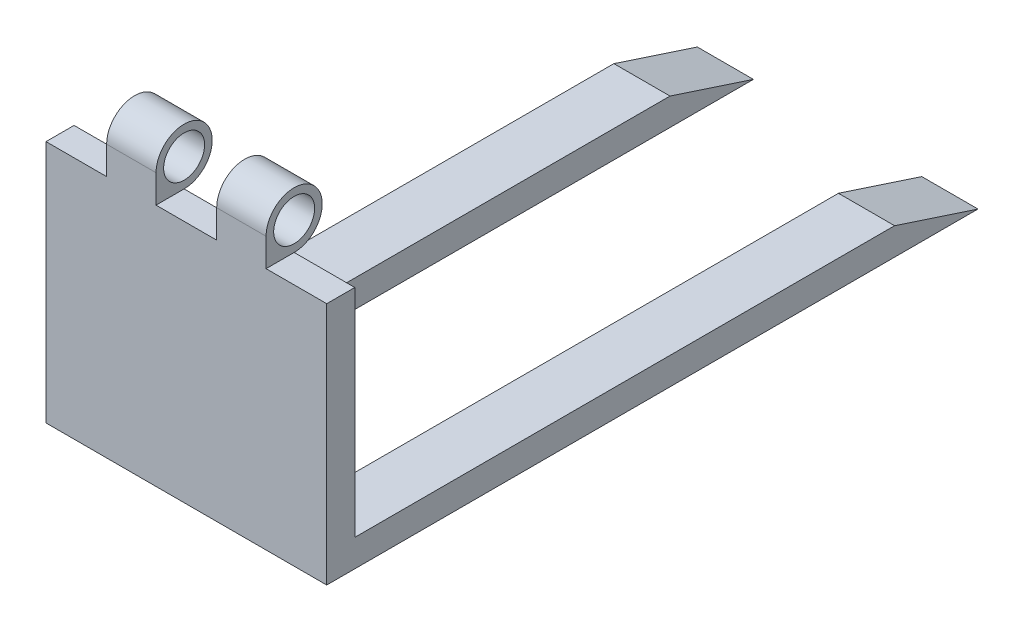
ISO-10303-21;
HEADER;
FILE_DESCRIPTION(('STEP AP214'),'2;1');
FILE_NAME('part.step','',(''),(''),'','','');
FILE_SCHEMA(('AUTOMOTIVE_DESIGN { 1 0 10303 214 1 1 1 1 }'));
ENDSEC;
DATA;
#1=APPLICATION_CONTEXT('core data for automotive mechanical design processes');
#2=APPLICATION_PROTOCOL_DEFINITION('international standard','automotive_design',2000,#1);
#3=PRODUCT_CONTEXT('',#1,'mechanical');
#4=PRODUCT('Part','Part','',(#3));
#5=PRODUCT_RELATED_PRODUCT_CATEGORY('part','',(#4));
#6=PRODUCT_DEFINITION_FORMATION('','',#4);
#7=PRODUCT_DEFINITION_CONTEXT('part definition',#1,'design');
#8=PRODUCT_DEFINITION('design','',#6,#7);
#9=PRODUCT_DEFINITION_SHAPE('','',#8);
#10=(LENGTH_UNIT() NAMED_UNIT(*) SI_UNIT(.MILLI.,.METRE.));
#11=(NAMED_UNIT(*) PLANE_ANGLE_UNIT() SI_UNIT($,.RADIAN.));
#12=(NAMED_UNIT(*) SI_UNIT($,.STERADIAN.) SOLID_ANGLE_UNIT());
#13=UNCERTAINTY_MEASURE_WITH_UNIT(LENGTH_MEASURE(1.E-05),#10,'distance_accuracy_value','');
#14=(GEOMETRIC_REPRESENTATION_CONTEXT(3) GLOBAL_UNCERTAINTY_ASSIGNED_CONTEXT((#13)) GLOBAL_UNIT_ASSIGNED_CONTEXT((#10,
#11,#12)) REPRESENTATION_CONTEXT('',''));
#15=CARTESIAN_POINT('',(0.,0.,0.));
#16=DIRECTION('',(0.,0.,1.));
#17=DIRECTION('',(1.,0.,0.));
#18=AXIS2_PLACEMENT_3D('',#15,#16,#17);
#19=CARTESIAN_POINT('',(31.75,61.468,0.));
#20=DIRECTION('',(-1.,0.,0.));
#21=DIRECTION('',(0.,0.,1.));
#22=AXIS2_PLACEMENT_3D('',#19,#20,#21);
#23=CYLINDRICAL_SURFACE('',#22,6.35);
#24=DIRECTION('',(-1.,0.,0.));
#25=VECTOR('',#24,1.);
#26=CARTESIAN_POINT('',(31.75,55.118,0.));
#27=LINE('',#26,#25);
#28=CARTESIAN_POINT('',(-6.85799999999999,55.118,0.));
#29=VERTEX_POINT('',#28);
#30=CARTESIAN_POINT('',(-18.034,55.118,0.));
#31=VERTEX_POINT('',#30);
#32=EDGE_CURVE('E294',#29,#31,#27,.T.);
#33=ORIENTED_EDGE('',*,*,#32,.T.);
#34=CARTESIAN_POINT('',(-18.034,61.468,0.));
#35=DIRECTION('',(1.,0.,0.));
#36=DIRECTION('',(0.,0.,-1.));
#37=AXIS2_PLACEMENT_3D('',#34,#35,#36);
#38=CIRCLE('',#37,6.35);
#39=CARTESIAN_POINT('',(-18.034,61.468,6.35));
#40=VERTEX_POINT('',#39);
#41=EDGE_CURVE('E50',#31,#40,#38,.T.);
#42=ORIENTED_EDGE('',*,*,#41,.T.);
#43=DIRECTION('',(-1.,0.,0.));
#44=VECTOR('',#43,1.);
#45=CARTESIAN_POINT('',(31.75,61.468,6.35));
#46=LINE('',#45,#44);
#47=CARTESIAN_POINT('',(-6.85799999999999,61.468,6.35));
#48=VERTEX_POINT('',#47);
#49=EDGE_CURVE('E42',#48,#40,#46,.T.);
#50=ORIENTED_EDGE('',*,*,#49,.F.);
#51=CARTESIAN_POINT('',(-6.85799999999999,61.468,0.));
#52=DIRECTION('',(-1.,0.,0.));
#53=DIRECTION('',(0.,-1.,0.));
#54=AXIS2_PLACEMENT_3D('',#51,#52,#53);
#55=CIRCLE('',#54,6.35);
#56=EDGE_CURVE('E174',#48,#29,#55,.T.);
#57=ORIENTED_EDGE('',*,*,#56,.T.);
#58=EDGE_LOOP('',(#33,#42,#50,#57));
#59=FACE_BOUND('',#58,.T.);
#60=ADVANCED_FACE('F33',(#59),#23,.T.);
#61=CARTESIAN_POINT('',(31.75,0.,0.));
#62=DIRECTION('',(0.,0.,1.));
#63=DIRECTION('',(0.,-1.,0.));
#64=AXIS2_PLACEMENT_3D('',#61,#62,#63);
#65=PLANE('',#64);
#66=CARTESIAN_POINT('',(31.75,55.118,0.));
#67=VERTEX_POINT('',#66);
#68=CARTESIAN_POINT('',(18.034,55.118,0.));
#69=VERTEX_POINT('',#68);
#70=EDGE_CURVE('E197',#67,#69,#27,.T.);
#71=ORIENTED_EDGE('',*,*,#70,.F.);
#72=DIRECTION('',(0.,1.,0.));
#73=VECTOR('',#72,1.);
#74=CARTESIAN_POINT('',(31.75,0.,0.));
#75=LINE('',#74,#73);
#76=CARTESIAN_POINT('',(31.75,6.16801841942253,0.));
#77=VERTEX_POINT('',#76);
#78=EDGE_CURVE('E249',#77,#67,#75,.T.);
#79=ORIENTED_EDGE('',*,*,#78,.F.);
#80=DIRECTION('',(-1.,0.,0.));
#81=VECTOR('',#80,1.);
#82=CARTESIAN_POINT('',(31.75,6.16801841942253,0.));
#83=LINE('',#82,#81);
#84=CARTESIAN_POINT('',(19.05,6.16801841942253,0.));
#85=VERTEX_POINT('',#84);
#86=EDGE_CURVE('E241',#77,#85,#83,.T.);
#87=ORIENTED_EDGE('',*,*,#86,.T.);
#88=DIRECTION('',(0.,1.,0.));
#89=VECTOR('',#88,1.);
#90=CARTESIAN_POINT('',(19.05,0.,0.));
#91=LINE('',#90,#89);
#92=CARTESIAN_POINT('',(19.05,0.,0.));
#93=VERTEX_POINT('',#92);
#94=EDGE_CURVE('E246',#93,#85,#91,.T.);
#95=ORIENTED_EDGE('',*,*,#94,.F.);
#96=DIRECTION('',(-1.,0.,0.));
#97=VECTOR('',#96,1.);
#98=CARTESIAN_POINT('',(31.75,0.,0.));
#99=LINE('',#98,#97);
#100=CARTESIAN_POINT('',(-19.05,0.,0.));
#101=VERTEX_POINT('',#100);
#102=EDGE_CURVE('E257',#93,#101,#99,.T.);
#103=ORIENTED_EDGE('',*,*,#102,.T.);
#104=DIRECTION('',(0.,-1.,0.));
#105=VECTOR('',#104,1.);
#106=CARTESIAN_POINT('',(-19.05,0.,0.));
#107=LINE('',#106,#105);
#108=CARTESIAN_POINT('',(-19.05,6.16801841942255,0.));
#109=VERTEX_POINT('',#108);
#110=EDGE_CURVE('E222',#109,#101,#107,.T.);
#111=ORIENTED_EDGE('',*,*,#110,.F.);
#112=DIRECTION('',(1.,0.,0.));
#113=VECTOR('',#112,1.);
#114=CARTESIAN_POINT('',(31.75,6.16801841942253,0.));
#115=LINE('',#114,#113);
#116=CARTESIAN_POINT('',(-31.75,6.16801841942253,0.));
#117=VERTEX_POINT('',#116);
#118=EDGE_CURVE('E217',#117,#109,#115,.T.);
#119=ORIENTED_EDGE('',*,*,#118,.F.);
#120=DIRECTION('',(0.,1.,0.));
#121=VECTOR('',#120,1.);
#122=CARTESIAN_POINT('',(-31.75,0.,0.));
#123=LINE('',#122,#121);
#124=CARTESIAN_POINT('',(-31.75,55.118,0.));
#125=VERTEX_POINT('',#124);
#126=EDGE_CURVE('E248',#117,#125,#123,.T.);
#127=ORIENTED_EDGE('',*,*,#126,.T.);
#128=EDGE_CURVE('E196',#31,#125,#27,.T.);
#129=ORIENTED_EDGE('',*,*,#128,.F.);
#130=ORIENTED_EDGE('',*,*,#32,.F.);
#131=CARTESIAN_POINT('',(6.85800000000001,55.118,0.));
#132=VERTEX_POINT('',#131);
#133=EDGE_CURVE('E292',#132,#29,#27,.T.);
#134=ORIENTED_EDGE('',*,*,#133,.F.);
#135=EDGE_CURVE('E201',#69,#132,#27,.T.);
#136=ORIENTED_EDGE('',*,*,#135,.F.);
#137=EDGE_LOOP('',(#71,#79,#87,#95,#103,#111,#119,#127,#129,#130,#134,#136));
#138=FACE_BOUND('',#137,.T.);
#139=ADVANCED_FACE('F35',(#138),#65,.F.);
#140=CARTESIAN_POINT('',(31.75,0.,6.35));
#141=DIRECTION('',(0.,0.,-1.));
#142=DIRECTION('',(-1.,0.,0.));
#143=AXIS2_PLACEMENT_3D('',#140,#141,#142);
#144=PLANE('',#143);
#145=ORIENTED_EDGE('',*,*,#49,.T.);
#146=DIRECTION('',(0.,-1.,0.));
#147=VECTOR('',#146,1.);
#148=CARTESIAN_POINT('',(-18.034,0.,6.35));
#149=LINE('',#148,#147);
#150=CARTESIAN_POINT('',(-18.034,55.118,6.34999999999999));
#151=VERTEX_POINT('',#150);
#152=EDGE_CURVE('E161',#40,#151,#149,.T.);
#153=ORIENTED_EDGE('',*,*,#152,.T.);
#154=DIRECTION('',(-1.,0.,0.));
#155=VECTOR('',#154,1.);
#156=CARTESIAN_POINT('',(31.75,55.118,6.35));
#157=LINE('',#156,#155);
#158=CARTESIAN_POINT('',(-31.75,55.118,6.34999999999999));
#159=VERTEX_POINT('',#158);
#160=EDGE_CURVE('E193',#151,#159,#157,.T.);
#161=ORIENTED_EDGE('',*,*,#160,.T.);
#162=DIRECTION('',(0.,-1.,0.));
#163=VECTOR('',#162,1.);
#164=CARTESIAN_POINT('',(-31.75,0.,6.35));
#165=LINE('',#164,#163);
#166=CARTESIAN_POINT('',(-31.75,0.,6.35));
#167=VERTEX_POINT('',#166);
#168=EDGE_CURVE('E260',#159,#167,#165,.T.);
#169=ORIENTED_EDGE('',*,*,#168,.T.);
#170=DIRECTION('',(-1.,0.,0.));
#171=VECTOR('',#170,1.);
#172=CARTESIAN_POINT('',(31.75,0.,6.35));
#173=LINE('',#172,#171);
#174=CARTESIAN_POINT('',(31.75,0.,6.35));
#175=VERTEX_POINT('',#174);
#176=EDGE_CURVE('E264',#175,#167,#173,.T.);
#177=ORIENTED_EDGE('',*,*,#176,.F.);
#178=DIRECTION('',(0.,-1.,0.));
#179=VECTOR('',#178,1.);
#180=CARTESIAN_POINT('',(31.75,0.,6.35));
#181=LINE('',#180,#179);
#182=CARTESIAN_POINT('',(31.75,55.118,6.34999999999999));
#183=VERTEX_POINT('',#182);
#184=EDGE_CURVE('E252',#183,#175,#181,.T.);
#185=ORIENTED_EDGE('',*,*,#184,.F.);
#186=DIRECTION('',(-1.,0.,0.));
#187=VECTOR('',#186,1.);
#188=CARTESIAN_POINT('',(31.75,55.118,6.35));
#189=LINE('',#188,#187);
#190=CARTESIAN_POINT('',(18.034,55.118,6.34999999999999));
#191=VERTEX_POINT('',#190);
#192=EDGE_CURVE('E160',#183,#191,#189,.T.);
#193=ORIENTED_EDGE('',*,*,#192,.T.);
#194=DIRECTION('',(0.,1.,0.));
#195=VECTOR('',#194,1.);
#196=CARTESIAN_POINT('',(18.034,0.,6.35));
#197=LINE('',#196,#195);
#198=CARTESIAN_POINT('',(18.034,61.468,6.35));
#199=VERTEX_POINT('',#198);
#200=EDGE_CURVE('E186',#191,#199,#197,.T.);
#201=ORIENTED_EDGE('',*,*,#200,.T.);
#202=CARTESIAN_POINT('',(6.85800000000001,61.468,6.35));
#203=VERTEX_POINT('',#202);
#204=EDGE_CURVE('E11',#199,#203,#46,.T.);
#205=ORIENTED_EDGE('',*,*,#204,.T.);
#206=DIRECTION('',(0.,-1.,0.));
#207=VECTOR('',#206,1.);
#208=CARTESIAN_POINT('',(6.85800000000002,0.,6.35));
#209=LINE('',#208,#207);
#210=CARTESIAN_POINT('',(6.85800000000001,55.118,6.34999999999999));
#211=VERTEX_POINT('',#210);
#212=EDGE_CURVE('E164',#203,#211,#209,.T.);
#213=ORIENTED_EDGE('',*,*,#212,.T.);
#214=DIRECTION('',(-1.,0.,0.));
#215=VECTOR('',#214,1.);
#216=CARTESIAN_POINT('',(31.75,55.118,6.35));
#217=LINE('',#216,#215);
#218=CARTESIAN_POINT('',(-6.85799999999999,55.118,6.34999999999999));
#219=VERTEX_POINT('',#218);
#220=EDGE_CURVE('E150',#211,#219,#217,.T.);
#221=ORIENTED_EDGE('',*,*,#220,.T.);
#222=DIRECTION('',(0.,1.,0.));
#223=VECTOR('',#222,1.);
#224=CARTESIAN_POINT('',(-6.85799999999998,0.,6.35));
#225=LINE('',#224,#223);
#226=EDGE_CURVE('E181',#219,#48,#225,.T.);
#227=ORIENTED_EDGE('',*,*,#226,.T.);
#228=EDGE_LOOP('',(#145,#153,#161,#169,#177,#185,#193,#201,#205,#213,#221,#227));
#229=FACE_BOUND('',#228,.T.);
#230=ADVANCED_FACE('F168',(#229),#144,.F.);
#231=CARTESIAN_POINT('',(31.75,0.,0.));
#232=DIRECTION('',(0.,1.,0.));
#233=DIRECTION('',(0.,0.,1.));
#234=AXIS2_PLACEMENT_3D('',#231,#232,#233);
#235=PLANE('',#234);
#236=DIRECTION('',(0.,0.,-1.));
#237=VECTOR('',#236,1.);
#238=CARTESIAN_POINT('',(-31.75,0.,0.));
#239=LINE('',#238,#237);
#240=CARTESIAN_POINT('',(-31.75,0.,-140.97));
#241=VERTEX_POINT('',#240);
#242=EDGE_CURVE('E253',#167,#241,#239,.T.);
#243=ORIENTED_EDGE('',*,*,#242,.T.);
#244=DIRECTION('',(-1.,0.,0.));
#245=VECTOR('',#244,1.);
#246=CARTESIAN_POINT('',(-19.05,0.,-140.97));
#247=LINE('',#246,#245);
#248=CARTESIAN_POINT('',(-19.05,0.,-140.97));
#249=VERTEX_POINT('',#248);
#250=EDGE_CURVE('E214',#249,#241,#247,.T.);
#251=ORIENTED_EDGE('',*,*,#250,.F.);
#252=DIRECTION('',(0.,0.,-1.));
#253=VECTOR('',#252,1.);
#254=CARTESIAN_POINT('',(-19.05,0.,6.35));
#255=LINE('',#254,#253);
#256=EDGE_CURVE('E208',#101,#249,#255,.T.);
#257=ORIENTED_EDGE('',*,*,#256,.F.);
#258=ORIENTED_EDGE('',*,*,#102,.F.);
#259=DIRECTION('',(0.,0.,-1.));
#260=VECTOR('',#259,1.);
#261=CARTESIAN_POINT('',(19.05,0.,6.35));
#262=LINE('',#261,#260);
#263=CARTESIAN_POINT('',(19.05,0.,-140.97));
#264=VERTEX_POINT('',#263);
#265=EDGE_CURVE('E226',#93,#264,#262,.T.);
#266=ORIENTED_EDGE('',*,*,#265,.T.);
#267=DIRECTION('',(1.,0.,0.));
#268=VECTOR('',#267,1.);
#269=CARTESIAN_POINT('',(19.05,0.,-140.97));
#270=LINE('',#269,#268);
#271=CARTESIAN_POINT('',(31.75,0.,-140.97));
#272=VERTEX_POINT('',#271);
#273=EDGE_CURVE('E235',#264,#272,#270,.T.);
#274=ORIENTED_EDGE('',*,*,#273,.T.);
#275=DIRECTION('',(0.,0.,-1.));
#276=VECTOR('',#275,1.);
#277=CARTESIAN_POINT('',(31.75,0.,0.));
#278=LINE('',#277,#276);
#279=EDGE_CURVE('E255',#175,#272,#278,.T.);
#280=ORIENTED_EDGE('',*,*,#279,.F.);
#281=ORIENTED_EDGE('',*,*,#176,.T.);
#282=EDGE_LOOP('',(#243,#251,#257,#258,#266,#274,#280,#281));
#283=FACE_BOUND('',#282,.T.);
#284=ADVANCED_FACE('F319',(#283),#235,.F.);
#285=CARTESIAN_POINT('',(31.75,0.,0.));
#286=DIRECTION('',(1.,0.,0.));
#287=DIRECTION('',(0.,0.,-1.));
#288=AXIS2_PLACEMENT_3D('',#285,#286,#287);
#289=PLANE('',#288);
#290=DIRECTION('',(0.,0.,1.));
#291=VECTOR('',#290,1.);
#292=CARTESIAN_POINT('',(31.75,55.118,-140.97));
#293=LINE('',#292,#291);
#294=EDGE_CURVE('E285',#67,#183,#293,.T.);
#295=ORIENTED_EDGE('',*,*,#294,.T.);
#296=ORIENTED_EDGE('',*,*,#184,.T.);
#297=ORIENTED_EDGE('',*,*,#279,.T.);
#298=DIRECTION('',(0.,0.310721915875595,0.950500863226646));
#299=VECTOR('',#298,1.);
#300=CARTESIAN_POINT('',(31.75,0.,-140.97));
#301=LINE('',#300,#299);
#302=CARTESIAN_POINT('',(31.75,6.16801841942255,-122.101981580577));
#303=VERTEX_POINT('',#302);
#304=EDGE_CURVE('E225',#272,#303,#301,.T.);
#305=ORIENTED_EDGE('',*,*,#304,.T.);
#306=DIRECTION('',(0.,0.,1.));
#307=VECTOR('',#306,1.);
#308=CARTESIAN_POINT('',(31.75,6.16801841942255,-122.101981580577));
#309=LINE('',#308,#307);
#310=EDGE_CURVE('E229',#303,#77,#309,.T.);
#311=ORIENTED_EDGE('',*,*,#310,.T.);
#312=ORIENTED_EDGE('',*,*,#78,.T.);
#313=EDGE_LOOP('',(#295,#296,#297,#305,#311,#312));
#314=FACE_BOUND('',#313,.T.);
#315=ADVANCED_FACE('F329',(#314),#289,.T.);
#316=CARTESIAN_POINT('',(-31.75,0.,0.));
#317=DIRECTION('',(1.,0.,0.));
#318=DIRECTION('',(0.,0.,-1.));
#319=AXIS2_PLACEMENT_3D('',#316,#317,#318);
#320=PLANE('',#319);
#321=ORIENTED_EDGE('',*,*,#168,.F.);
#322=DIRECTION('',(0.,0.,1.));
#323=VECTOR('',#322,1.);
#324=CARTESIAN_POINT('',(-31.75,55.118,-140.97));
#325=LINE('',#324,#323);
#326=EDGE_CURVE('E300',#125,#159,#325,.T.);
#327=ORIENTED_EDGE('',*,*,#326,.F.);
#328=ORIENTED_EDGE('',*,*,#126,.F.);
#329=DIRECTION('',(0.,0.,1.));
#330=VECTOR('',#329,1.);
#331=CARTESIAN_POINT('',(-31.75,6.16801841942255,-122.101981580577));
#332=LINE('',#331,#330);
#333=CARTESIAN_POINT('',(-31.75,6.16801841942255,-122.101981580577));
#334=VERTEX_POINT('',#333);
#335=EDGE_CURVE('E200',#334,#117,#332,.T.);
#336=ORIENTED_EDGE('',*,*,#335,.F.);
#337=DIRECTION('',(0.,0.310721915875595,0.950500863226646));
#338=VECTOR('',#337,1.);
#339=CARTESIAN_POINT('',(-31.75,0.,-140.97));
#340=LINE('',#339,#338);
#341=EDGE_CURVE('E206',#241,#334,#340,.T.);
#342=ORIENTED_EDGE('',*,*,#341,.F.);
#343=ORIENTED_EDGE('',*,*,#242,.F.);
#344=EDGE_LOOP('',(#321,#327,#328,#336,#342,#343));
#345=FACE_BOUND('',#344,.T.);
#346=ADVANCED_FACE('F303',(#345),#320,.F.);
#347=CARTESIAN_POINT('',(19.05,0.,0.));
#348=DIRECTION('',(1.,0.,0.));
#349=DIRECTION('',(0.,0.,-1.));
#350=AXIS2_PLACEMENT_3D('',#347,#348,#349);
#351=PLANE('',#350);
#352=ORIENTED_EDGE('',*,*,#265,.F.);
#353=ORIENTED_EDGE('',*,*,#94,.T.);
#354=DIRECTION('',(0.,0.,1.));
#355=VECTOR('',#354,1.);
#356=CARTESIAN_POINT('',(19.05,6.16801841942255,-122.101981580577));
#357=LINE('',#356,#355);
#358=CARTESIAN_POINT('',(19.05,6.16801841942255,-122.101981580577));
#359=VERTEX_POINT('',#358);
#360=EDGE_CURVE('E232',#359,#85,#357,.T.);
#361=ORIENTED_EDGE('',*,*,#360,.F.);
#362=DIRECTION('',(0.,0.310721915875595,0.950500863226646));
#363=VECTOR('',#362,1.);
#364=CARTESIAN_POINT('',(19.05,0.,-140.97));
#365=LINE('',#364,#363);
#366=EDGE_CURVE('E228',#264,#359,#365,.T.);
#367=ORIENTED_EDGE('',*,*,#366,.F.);
#368=EDGE_LOOP('',(#352,#353,#361,#367));
#369=FACE_BOUND('',#368,.T.);
#370=ADVANCED_FACE('F356',(#369),#351,.F.);
#371=CARTESIAN_POINT('',(19.05,6.16801841942255,-122.101981580577));
#372=DIRECTION('',(0.,1.,0.));
#373=DIRECTION('',(0.,0.,1.));
#374=AXIS2_PLACEMENT_3D('',#371,#372,#373);
#375=PLANE('',#374);
#376=ORIENTED_EDGE('',*,*,#86,.F.);
#377=ORIENTED_EDGE('',*,*,#310,.F.);
#378=DIRECTION('',(1.,0.,0.));
#379=VECTOR('',#378,1.);
#380=CARTESIAN_POINT('',(19.05,6.16801841942255,-122.101981580577));
#381=LINE('',#380,#379);
#382=EDGE_CURVE('E239',#359,#303,#381,.T.);
#383=ORIENTED_EDGE('',*,*,#382,.F.);
#384=ORIENTED_EDGE('',*,*,#360,.T.);
#385=EDGE_LOOP('',(#376,#377,#383,#384));
#386=FACE_BOUND('',#385,.T.);
#387=ADVANCED_FACE('F363',(#386),#375,.T.);
#388=CARTESIAN_POINT('',(19.05,0.,-140.97));
#389=DIRECTION('',(0.,0.950500863226646,-0.310721915875595));
#390=DIRECTION('',(0.,0.310721915875595,0.950500863226646));
#391=AXIS2_PLACEMENT_3D('',#388,#389,#390);
#392=PLANE('',#391);
#393=ORIENTED_EDGE('',*,*,#304,.F.);
#394=ORIENTED_EDGE('',*,*,#273,.F.);
#395=ORIENTED_EDGE('',*,*,#366,.T.);
#396=ORIENTED_EDGE('',*,*,#382,.T.);
#397=EDGE_LOOP('',(#393,#394,#395,#396));
#398=FACE_BOUND('',#397,.T.);
#399=ADVANCED_FACE('F359',(#398),#392,.T.);
#400=CARTESIAN_POINT('',(-19.05,0.,0.));
#401=DIRECTION('',(-1.,0.,0.));
#402=DIRECTION('',(0.,0.,-1.));
#403=AXIS2_PLACEMENT_3D('',#400,#401,#402);
#404=PLANE('',#403);
#405=DIRECTION('',(0.,0.,1.));
#406=VECTOR('',#405,1.);
#407=CARTESIAN_POINT('',(-19.05,6.16801841942255,-122.101981580577));
#408=LINE('',#407,#406);
#409=CARTESIAN_POINT('',(-19.05,6.16801841942255,-122.101981580577));
#410=VERTEX_POINT('',#409);
#411=EDGE_CURVE('E202',#410,#109,#408,.T.);
#412=ORIENTED_EDGE('',*,*,#411,.T.);
#413=ORIENTED_EDGE('',*,*,#110,.T.);
#414=ORIENTED_EDGE('',*,*,#256,.T.);
#415=DIRECTION('',(0.,0.310721915875595,0.950500863226646));
#416=VECTOR('',#415,1.);
#417=CARTESIAN_POINT('',(-19.05,0.,-140.97));
#418=LINE('',#417,#416);
#419=EDGE_CURVE('E205',#249,#410,#418,.T.);
#420=ORIENTED_EDGE('',*,*,#419,.T.);
#421=EDGE_LOOP('',(#412,#413,#414,#420));
#422=FACE_BOUND('',#421,.T.);
#423=ADVANCED_FACE('F362',(#422),#404,.F.);
#424=CARTESIAN_POINT('',(-19.05,6.16801841942255,-122.101981580577));
#425=DIRECTION('',(0.,-1.,0.));
#426=DIRECTION('',(0.,0.,-1.));
#427=AXIS2_PLACEMENT_3D('',#424,#425,#426);
#428=PLANE('',#427);
#429=ORIENTED_EDGE('',*,*,#335,.T.);
#430=ORIENTED_EDGE('',*,*,#118,.T.);
#431=ORIENTED_EDGE('',*,*,#411,.F.);
#432=DIRECTION('',(-1.,0.,0.));
#433=VECTOR('',#432,1.);
#434=CARTESIAN_POINT('',(-19.05,6.16801841942255,-122.101981580577));
#435=LINE('',#434,#433);
#436=EDGE_CURVE('E210',#410,#334,#435,.T.);
#437=ORIENTED_EDGE('',*,*,#436,.T.);
#438=EDGE_LOOP('',(#429,#430,#431,#437));
#439=FACE_BOUND('',#438,.T.);
#440=ADVANCED_FACE('F310',(#439),#428,.F.);
#441=CARTESIAN_POINT('',(-19.05,0.,-140.97));
#442=DIRECTION('',(0.,-0.950500863226646,0.310721915875595));
#443=DIRECTION('',(0.,-0.310721915875595,-0.950500863226646));
#444=AXIS2_PLACEMENT_3D('',#441,#442,#443);
#445=PLANE('',#444);
#446=ORIENTED_EDGE('',*,*,#341,.T.);
#447=ORIENTED_EDGE('',*,*,#436,.F.);
#448=ORIENTED_EDGE('',*,*,#419,.F.);
#449=ORIENTED_EDGE('',*,*,#250,.T.);
#450=EDGE_LOOP('',(#446,#447,#448,#449));
#451=FACE_BOUND('',#450,.T.);
#452=ADVANCED_FACE('F314',(#451),#445,.F.);
#453=CARTESIAN_POINT('',(18.034,61.468,0.));
#454=DIRECTION('',(-1.,0.,0.));
#455=DIRECTION('',(0.,0.,1.));
#456=AXIS2_PLACEMENT_3D('',#453,#454,#455);
#457=CIRCLE('',#456,6.35);
#458=EDGE_CURVE('E184',#199,#69,#457,.T.);
#459=ORIENTED_EDGE('',*,*,#458,.T.);
#460=ORIENTED_EDGE('',*,*,#135,.T.);
#461=CARTESIAN_POINT('',(6.85800000000001,61.468,0.));
#462=DIRECTION('',(1.,0.,0.));
#463=DIRECTION('',(0.,1.,0.));
#464=AXIS2_PLACEMENT_3D('',#461,#462,#463);
#465=CIRCLE('',#464,6.35);
#466=EDGE_CURVE('E58',#132,#203,#465,.T.);
#467=ORIENTED_EDGE('',*,*,#466,.T.);
#468=ORIENTED_EDGE('',*,*,#204,.F.);
#469=EDGE_LOOP('',(#459,#460,#467,#468));
#470=FACE_BOUND('',#469,.T.);
#471=ADVANCED_FACE('F330',(#470),#23,.T.);
#472=CARTESIAN_POINT('',(-6.85799999999999,55.118,-140.97));
#473=DIRECTION('',(0.,-1.,0.));
#474=DIRECTION('',(0.,0.,-1.));
#475=AXIS2_PLACEMENT_3D('',#472,#473,#474);
#476=PLANE('',#475);
#477=DIRECTION('',(0.,0.,1.));
#478=VECTOR('',#477,1.);
#479=CARTESIAN_POINT('',(6.85800000000001,55.118,-140.97));
#480=LINE('',#479,#478);
#481=EDGE_CURVE('E153',#132,#211,#480,.T.);
#482=ORIENTED_EDGE('',*,*,#481,.F.);
#483=ORIENTED_EDGE('',*,*,#133,.T.);
#484=DIRECTION('',(0.,0.,1.));
#485=VECTOR('',#484,1.);
#486=CARTESIAN_POINT('',(-6.85799999999999,55.118,-140.97));
#487=LINE('',#486,#485);
#488=EDGE_CURVE('E156',#29,#219,#487,.T.);
#489=ORIENTED_EDGE('',*,*,#488,.T.);
#490=ORIENTED_EDGE('',*,*,#220,.F.);
#491=EDGE_LOOP('',(#482,#483,#489,#490));
#492=FACE_BOUND('',#491,.T.);
#493=ADVANCED_FACE('F151',(#492),#476,.F.);
#494=CARTESIAN_POINT('',(-6.85799999999999,67.818,-140.97));
#495=DIRECTION('',(-1.,0.,0.));
#496=DIRECTION('',(0.,-1.,0.));
#497=AXIS2_PLACEMENT_3D('',#494,#495,#496);
#498=PLANE('',#497);
#499=CARTESIAN_POINT('',(-6.85799999999999,61.468,0.));
#500=DIRECTION('',(-1.,0.,0.));
#501=DIRECTION('',(0.,-1.,0.));
#502=AXIS2_PLACEMENT_3D('',#499,#500,#501);
#503=CIRCLE('',#502,4.6355);
#504=CARTESIAN_POINT('',(-6.85799999999999,56.8325,0.));
#505=VERTEX_POINT('',#504);
#506=EDGE_CURVE('E171',#505,#505,#503,.F.);
#507=ORIENTED_EDGE('',*,*,#506,.F.);
#508=EDGE_LOOP('',(#507));
#509=FACE_BOUND('',#508,.T.);
#510=ORIENTED_EDGE('',*,*,#488,.F.);
#511=ORIENTED_EDGE('',*,*,#56,.F.);
#512=ORIENTED_EDGE('',*,*,#226,.F.);
#513=EDGE_LOOP('',(#510,#511,#512));
#514=FACE_BOUND('',#513,.T.);
#515=ADVANCED_FACE('F337',(#509,#514),#498,.F.);
#516=CARTESIAN_POINT('',(6.85800000000001,67.818,-140.97));
#517=DIRECTION('',(1.,0.,0.));
#518=DIRECTION('',(0.,1.,0.));
#519=AXIS2_PLACEMENT_3D('',#516,#517,#518);
#520=PLANE('',#519);
#521=CARTESIAN_POINT('',(6.85800000000001,61.468,0.));
#522=DIRECTION('',(1.,0.,0.));
#523=DIRECTION('',(0.,1.,0.));
#524=AXIS2_PLACEMENT_3D('',#521,#522,#523);
#525=CIRCLE('',#524,4.6355);
#526=CARTESIAN_POINT('',(6.85800000000001,66.1035,0.));
#527=VERTEX_POINT('',#526);
#528=EDGE_CURVE('E176',#527,#527,#525,.F.);
#529=ORIENTED_EDGE('',*,*,#528,.F.);
#530=EDGE_LOOP('',(#529));
#531=FACE_BOUND('',#530,.T.);
#532=ORIENTED_EDGE('',*,*,#466,.F.);
#533=ORIENTED_EDGE('',*,*,#481,.T.);
#534=ORIENTED_EDGE('',*,*,#212,.F.);
#535=EDGE_LOOP('',(#532,#533,#534));
#536=FACE_BOUND('',#535,.T.);
#537=ADVANCED_FACE('F163',(#531,#536),#520,.F.);
#538=CARTESIAN_POINT('',(-31.75,61.468,0.));
#539=DIRECTION('',(1.,0.,0.));
#540=DIRECTION('',(0.,0.,-1.));
#541=AXIS2_PLACEMENT_3D('',#538,#539,#540);
#542=CYLINDRICAL_SURFACE('',#541,4.6355);
#543=CARTESIAN_POINT('',(-18.034,61.468,0.));
#544=DIRECTION('',(1.,0.,0.));
#545=DIRECTION('',(0.,0.,-1.));
#546=AXIS2_PLACEMENT_3D('',#543,#544,#545);
#547=CIRCLE('',#546,4.6355);
#548=CARTESIAN_POINT('',(-18.034,61.468,-4.6355));
#549=VERTEX_POINT('',#548);
#550=EDGE_CURVE('E37',#549,#549,#547,.F.);
#551=ORIENTED_EDGE('',*,*,#550,.T.);
#552=EDGE_LOOP('',(#551));
#553=FACE_BOUND('',#552,.T.);
#554=ORIENTED_EDGE('',*,*,#506,.T.);
#555=EDGE_LOOP('',(#554));
#556=FACE_BOUND('',#555,.T.);
#557=ADVANCED_FACE('F444',(#553,#556),#542,.F.);
#558=CARTESIAN_POINT('',(31.75,55.118,-140.97));
#559=DIRECTION('',(0.,-1.,0.));
#560=DIRECTION('',(0.,0.,-1.));
#561=AXIS2_PLACEMENT_3D('',#558,#559,#560);
#562=PLANE('',#561);
#563=ORIENTED_EDGE('',*,*,#294,.F.);
#564=ORIENTED_EDGE('',*,*,#70,.T.);
#565=DIRECTION('',(0.,0.,1.));
#566=VECTOR('',#565,1.);
#567=CARTESIAN_POINT('',(18.034,55.118,-140.97));
#568=LINE('',#567,#566);
#569=EDGE_CURVE('E165',#69,#191,#568,.T.);
#570=ORIENTED_EDGE('',*,*,#569,.T.);
#571=ORIENTED_EDGE('',*,*,#192,.F.);
#572=EDGE_LOOP('',(#563,#564,#570,#571));
#573=FACE_BOUND('',#572,.T.);
#574=ADVANCED_FACE('F279',(#573),#562,.F.);
#575=CARTESIAN_POINT('',(18.034,67.818,-140.97));
#576=DIRECTION('',(-1.,0.,0.));
#577=DIRECTION('',(0.,0.,1.));
#578=AXIS2_PLACEMENT_3D('',#575,#576,#577);
#579=PLANE('',#578);
#580=CARTESIAN_POINT('',(18.034,61.468,0.));
#581=DIRECTION('',(-1.,0.,0.));
#582=DIRECTION('',(0.,0.,1.));
#583=AXIS2_PLACEMENT_3D('',#580,#581,#582);
#584=CIRCLE('',#583,4.6355);
#585=CARTESIAN_POINT('',(18.034,61.468,4.6355));
#586=VERTEX_POINT('',#585);
#587=EDGE_CURVE('E183',#586,#586,#584,.F.);
#588=ORIENTED_EDGE('',*,*,#587,.F.);
#589=EDGE_LOOP('',(#588));
#590=FACE_BOUND('',#589,.T.);
#591=ORIENTED_EDGE('',*,*,#569,.F.);
#592=ORIENTED_EDGE('',*,*,#458,.F.);
#593=ORIENTED_EDGE('',*,*,#200,.F.);
#594=EDGE_LOOP('',(#591,#592,#593));
#595=FACE_BOUND('',#594,.T.);
#596=ADVANCED_FACE('F275',(#590,#595),#579,.F.);
#597=CARTESIAN_POINT('',(-31.75,55.118,-140.97));
#598=DIRECTION('',(0.,-1.,0.));
#599=DIRECTION('',(0.,0.,-1.));
#600=AXIS2_PLACEMENT_3D('',#597,#598,#599);
#601=PLANE('',#600);
#602=DIRECTION('',(0.,0.,1.));
#603=VECTOR('',#602,1.);
#604=CARTESIAN_POINT('',(-18.034,55.118,-140.97));
#605=LINE('',#604,#603);
#606=EDGE_CURVE('E268',#31,#151,#605,.T.);
#607=ORIENTED_EDGE('',*,*,#606,.F.);
#608=ORIENTED_EDGE('',*,*,#128,.T.);
#609=ORIENTED_EDGE('',*,*,#326,.T.);
#610=ORIENTED_EDGE('',*,*,#160,.F.);
#611=EDGE_LOOP('',(#607,#608,#609,#610));
#612=FACE_BOUND('',#611,.T.);
#613=ADVANCED_FACE('F278',(#612),#601,.F.);
#614=CARTESIAN_POINT('',(-18.034,67.818,-140.97));
#615=DIRECTION('',(1.,0.,0.));
#616=DIRECTION('',(0.,0.,-1.));
#617=AXIS2_PLACEMENT_3D('',#614,#615,#616);
#618=PLANE('',#617);
#619=ORIENTED_EDGE('',*,*,#550,.F.);
#620=EDGE_LOOP('',(#619));
#621=FACE_BOUND('',#620,.T.);
#622=ORIENTED_EDGE('',*,*,#41,.F.);
#623=ORIENTED_EDGE('',*,*,#606,.T.);
#624=ORIENTED_EDGE('',*,*,#152,.F.);
#625=EDGE_LOOP('',(#622,#623,#624));
#626=FACE_BOUND('',#625,.T.);
#627=ADVANCED_FACE('F324',(#621,#626),#618,.F.);
#628=ORIENTED_EDGE('',*,*,#587,.T.);
#629=EDGE_LOOP('',(#628));
#630=FACE_BOUND('',#629,.T.);
#631=ORIENTED_EDGE('',*,*,#528,.T.);
#632=EDGE_LOOP('',(#631));
#633=FACE_BOUND('',#632,.T.);
#634=ADVANCED_FACE('F272',(#630,#633),#542,.F.);
#635=CLOSED_SHELL('',(#60,#139,#230,#284,#315,#346,#370,#387,#399,#423,#440,#452,#471,#493,#515,
#537,#557,#574,#596,#613,#627,#634));
#636=MANIFOLD_SOLID_BREP('B2',#635);
#637=ADVANCED_BREP_SHAPE_REPRESENTATION('',(#18,#636),#14);
#638=SHAPE_DEFINITION_REPRESENTATION(#9,#637);
ENDSEC;
END-ISO-10303-21;
